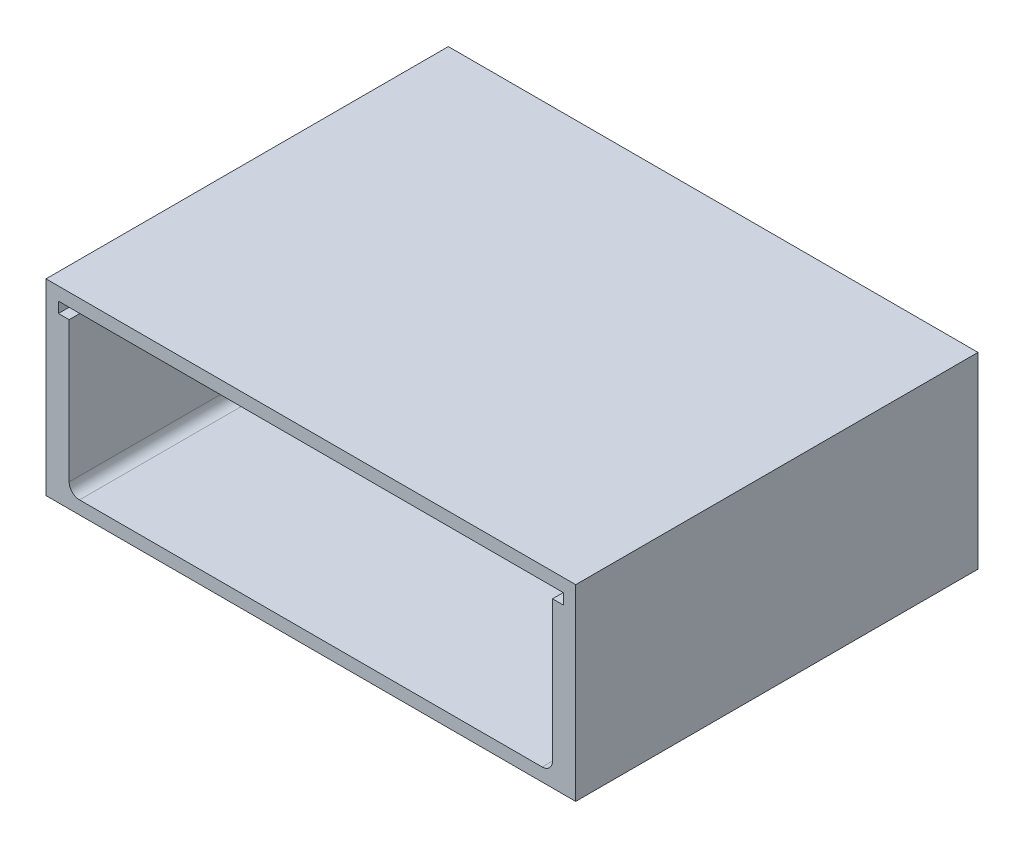
ISO-10303-21;
HEADER;
FILE_DESCRIPTION(('STEP AP214'),'2;1');
FILE_NAME('part.step','',(''),(''),'','','');
FILE_SCHEMA(('AUTOMOTIVE_DESIGN { 1 0 10303 214 1 1 1 1 }'));
ENDSEC;
DATA;
#1=APPLICATION_CONTEXT('core data for automotive mechanical design processes');
#2=APPLICATION_PROTOCOL_DEFINITION('international standard','automotive_design',2000,#1);
#3=PRODUCT_CONTEXT('',#1,'mechanical');
#4=PRODUCT('Part','Part','',(#3));
#5=PRODUCT_RELATED_PRODUCT_CATEGORY('part','',(#4));
#6=PRODUCT_DEFINITION_FORMATION('','',#4);
#7=PRODUCT_DEFINITION_CONTEXT('part definition',#1,'design');
#8=PRODUCT_DEFINITION('design','',#6,#7);
#9=PRODUCT_DEFINITION_SHAPE('','',#8);
#10=(LENGTH_UNIT() NAMED_UNIT(*) SI_UNIT(.MILLI.,.METRE.));
#11=(NAMED_UNIT(*) PLANE_ANGLE_UNIT() SI_UNIT($,.RADIAN.));
#12=(NAMED_UNIT(*) SI_UNIT($,.STERADIAN.) SOLID_ANGLE_UNIT());
#13=UNCERTAINTY_MEASURE_WITH_UNIT(LENGTH_MEASURE(1.E-05),#10,'distance_accuracy_value','');
#14=(GEOMETRIC_REPRESENTATION_CONTEXT(3) GLOBAL_UNCERTAINTY_ASSIGNED_CONTEXT((#13)) GLOBAL_UNIT_ASSIGNED_CONTEXT((#10,
#11,#12)) REPRESENTATION_CONTEXT('',''));
#15=CARTESIAN_POINT('',(0.,0.,0.));
#16=DIRECTION('',(0.,0.,1.));
#17=DIRECTION('',(1.,0.,0.));
#18=AXIS2_PLACEMENT_3D('',#15,#16,#17);
#19=CARTESIAN_POINT('',(0.,0.,60.));
#20=DIRECTION('',(1.,0.,0.));
#21=DIRECTION('',(0.,0.,-1.));
#22=AXIS2_PLACEMENT_3D('',#19,#20,#21);
#23=PLANE('',#22);
#24=DIRECTION('',(0.,-1.,0.));
#25=VECTOR('',#24,1.);
#26=CARTESIAN_POINT('',(0.,0.,0.));
#27=LINE('',#26,#25);
#28=CARTESIAN_POINT('',(0.,28.,0.));
#29=VERTEX_POINT('',#28);
#30=CARTESIAN_POINT('',(0.,0.,0.));
#31=VERTEX_POINT('',#30);
#32=EDGE_CURVE('E322',#29,#31,#27,.T.);
#33=ORIENTED_EDGE('',*,*,#32,.T.);
#34=DIRECTION('',(0.,0.,-1.));
#35=VECTOR('',#34,1.);
#36=CARTESIAN_POINT('',(0.,0.,60.));
#37=LINE('',#36,#35);
#38=CARTESIAN_POINT('',(0.,0.,60.));
#39=VERTEX_POINT('',#38);
#40=EDGE_CURVE('E359',#39,#31,#37,.T.);
#41=ORIENTED_EDGE('',*,*,#40,.F.);
#42=DIRECTION('',(0.,-1.,0.));
#43=VECTOR('',#42,1.);
#44=CARTESIAN_POINT('',(0.,0.,60.));
#45=LINE('',#44,#43);
#46=CARTESIAN_POINT('',(0.,28.,60.));
#47=VERTEX_POINT('',#46);
#48=EDGE_CURVE('E333',#47,#39,#45,.T.);
#49=ORIENTED_EDGE('',*,*,#48,.F.);
#50=DIRECTION('',(0.,0.,-1.));
#51=VECTOR('',#50,1.);
#52=CARTESIAN_POINT('',(0.,28.,60.));
#53=LINE('',#52,#51);
#54=EDGE_CURVE('E343',#47,#29,#53,.T.);
#55=ORIENTED_EDGE('',*,*,#54,.T.);
#56=EDGE_LOOP('',(#33,#41,#49,#55));
#57=FACE_BOUND('',#56,.T.);
#58=ADVANCED_FACE('F33',(#57),#23,.F.);
#59=CARTESIAN_POINT('',(0.,0.,60.));
#60=DIRECTION('',(0.,1.,0.));
#61=DIRECTION('',(0.,0.,1.));
#62=AXIS2_PLACEMENT_3D('',#59,#60,#61);
#63=PLANE('',#62);
#64=DIRECTION('',(1.,0.,0.));
#65=VECTOR('',#64,1.);
#66=CARTESIAN_POINT('',(0.,0.,0.));
#67=LINE('',#66,#65);
#68=CARTESIAN_POINT('',(79.,0.,0.));
#69=VERTEX_POINT('',#68);
#70=EDGE_CURVE('E346',#31,#69,#67,.T.);
#71=ORIENTED_EDGE('',*,*,#70,.T.);
#72=DIRECTION('',(0.,0.,-1.));
#73=VECTOR('',#72,1.);
#74=CARTESIAN_POINT('',(79.,0.,60.));
#75=LINE('',#74,#73);
#76=CARTESIAN_POINT('',(79.,0.,60.));
#77=VERTEX_POINT('',#76);
#78=EDGE_CURVE('E356',#77,#69,#75,.T.);
#79=ORIENTED_EDGE('',*,*,#78,.F.);
#80=DIRECTION('',(1.,0.,0.));
#81=VECTOR('',#80,1.);
#82=CARTESIAN_POINT('',(0.,0.,60.));
#83=LINE('',#82,#81);
#84=EDGE_CURVE('E336',#39,#77,#83,.T.);
#85=ORIENTED_EDGE('',*,*,#84,.F.);
#86=ORIENTED_EDGE('',*,*,#40,.T.);
#87=EDGE_LOOP('',(#71,#79,#85,#86));
#88=FACE_BOUND('',#87,.T.);
#89=ADVANCED_FACE('F524',(#88),#63,.F.);
#90=CARTESIAN_POINT('',(79.,0.,60.));
#91=DIRECTION('',(-1.,0.,0.));
#92=DIRECTION('',(0.,0.,1.));
#93=AXIS2_PLACEMENT_3D('',#90,#91,#92);
#94=PLANE('',#93);
#95=DIRECTION('',(0.,1.,0.));
#96=VECTOR('',#95,1.);
#97=CARTESIAN_POINT('',(79.,0.,0.));
#98=LINE('',#97,#96);
#99=CARTESIAN_POINT('',(79.,28.,0.));
#100=VERTEX_POINT('',#99);
#101=EDGE_CURVE('E348',#69,#100,#98,.T.);
#102=ORIENTED_EDGE('',*,*,#101,.T.);
#103=DIRECTION('',(0.,0.,-1.));
#104=VECTOR('',#103,1.);
#105=CARTESIAN_POINT('',(79.,28.,60.));
#106=LINE('',#105,#104);
#107=CARTESIAN_POINT('',(79.,28.,60.));
#108=VERTEX_POINT('',#107);
#109=EDGE_CURVE('E353',#108,#100,#106,.T.);
#110=ORIENTED_EDGE('',*,*,#109,.F.);
#111=DIRECTION('',(0.,1.,0.));
#112=VECTOR('',#111,1.);
#113=CARTESIAN_POINT('',(79.,0.,60.));
#114=LINE('',#113,#112);
#115=EDGE_CURVE('E339',#77,#108,#114,.T.);
#116=ORIENTED_EDGE('',*,*,#115,.F.);
#117=ORIENTED_EDGE('',*,*,#78,.T.);
#118=EDGE_LOOP('',(#102,#110,#116,#117));
#119=FACE_BOUND('',#118,.T.);
#120=ADVANCED_FACE('F530',(#119),#94,.F.);
#121=CARTESIAN_POINT('',(0.,28.,60.));
#122=DIRECTION('',(0.,-1.,0.));
#123=DIRECTION('',(0.,0.,-1.));
#124=AXIS2_PLACEMENT_3D('',#121,#122,#123);
#125=PLANE('',#124);
#126=DIRECTION('',(-1.,0.,0.));
#127=VECTOR('',#126,1.);
#128=CARTESIAN_POINT('',(0.,28.,0.));
#129=LINE('',#128,#127);
#130=EDGE_CURVE('E337',#100,#29,#129,.T.);
#131=ORIENTED_EDGE('',*,*,#130,.T.);
#132=ORIENTED_EDGE('',*,*,#54,.F.);
#133=DIRECTION('',(-1.,0.,0.));
#134=VECTOR('',#133,1.);
#135=CARTESIAN_POINT('',(0.,28.,60.));
#136=LINE('',#135,#134);
#137=EDGE_CURVE('E341',#108,#47,#136,.T.);
#138=ORIENTED_EDGE('',*,*,#137,.F.);
#139=ORIENTED_EDGE('',*,*,#109,.T.);
#140=EDGE_LOOP('',(#131,#132,#138,#139));
#141=FACE_BOUND('',#140,.T.);
#142=ADVANCED_FACE('F584',(#141),#125,.F.);
#143=CARTESIAN_POINT('',(0.,0.,60.));
#144=DIRECTION('',(0.,0.,-1.));
#145=DIRECTION('',(-1.,0.,0.));
#146=AXIS2_PLACEMENT_3D('',#143,#144,#145);
#147=PLANE('',#146);
#148=DIRECTION('',(0.,-1.,0.));
#149=VECTOR('',#148,1.);
#150=CARTESIAN_POINT('',(1.85,26.05,60.));
#151=LINE('',#150,#149);
#152=CARTESIAN_POINT('',(1.85,26.05,60.));
#153=VERTEX_POINT('',#152);
#154=CARTESIAN_POINT('',(1.85,24.45,60.));
#155=VERTEX_POINT('',#154);
#156=EDGE_CURVE('E273',#153,#155,#151,.T.);
#157=ORIENTED_EDGE('',*,*,#156,.F.);
#158=DIRECTION('',(-1.,0.,0.));
#159=VECTOR('',#158,1.);
#160=CARTESIAN_POINT('',(3.45,26.05,60.));
#161=LINE('',#160,#159);
#162=CARTESIAN_POINT('',(77.15,26.05,60.));
#163=VERTEX_POINT('',#162);
#164=EDGE_CURVE('E278',#163,#153,#161,.T.);
#165=ORIENTED_EDGE('',*,*,#164,.F.);
#166=DIRECTION('',(0.,1.,0.));
#167=VECTOR('',#166,1.);
#168=CARTESIAN_POINT('',(77.15,26.05,60.));
#169=LINE('',#168,#167);
#170=CARTESIAN_POINT('',(77.15,24.45,60.));
#171=VERTEX_POINT('',#170);
#172=EDGE_CURVE('E315',#171,#163,#169,.T.);
#173=ORIENTED_EDGE('',*,*,#172,.F.);
#174=DIRECTION('',(1.,0.,0.));
#175=VECTOR('',#174,1.);
#176=CARTESIAN_POINT('',(75.55,24.45,60.));
#177=LINE('',#176,#175);
#178=CARTESIAN_POINT('',(75.55,24.45,60.));
#179=VERTEX_POINT('',#178);
#180=EDGE_CURVE('E312',#179,#171,#177,.T.);
#181=ORIENTED_EDGE('',*,*,#180,.F.);
#182=DIRECTION('',(0.,1.,0.));
#183=VECTOR('',#182,1.);
#184=CARTESIAN_POINT('',(75.55,24.45,60.));
#185=LINE('',#184,#183);
#186=CARTESIAN_POINT('',(75.55,3.50000000000001,60.));
#187=VERTEX_POINT('',#186);
#188=EDGE_CURVE('E310',#187,#179,#185,.T.);
#189=ORIENTED_EDGE('',*,*,#188,.F.);
#190=CARTESIAN_POINT('',(74.,3.5,60.));
#191=DIRECTION('',(0.,0.,-1.));
#192=DIRECTION('',(-1.,0.,0.));
#193=AXIS2_PLACEMENT_3D('',#190,#191,#192);
#194=CIRCLE('',#193,1.55);
#195=CARTESIAN_POINT('',(74.,1.95,60.));
#196=VERTEX_POINT('',#195);
#197=EDGE_CURVE('E376',#187,#196,#194,.T.);
#198=ORIENTED_EDGE('',*,*,#197,.T.);
#199=DIRECTION('',(1.,0.,0.));
#200=VECTOR('',#199,1.);
#201=CARTESIAN_POINT('',(3.45,1.95,60.));
#202=LINE('',#201,#200);
#203=CARTESIAN_POINT('',(5.,1.95,60.));
#204=VERTEX_POINT('',#203);
#205=EDGE_CURVE('E307',#204,#196,#202,.T.);
#206=ORIENTED_EDGE('',*,*,#205,.F.);
#207=CARTESIAN_POINT('',(5.,3.5,60.));
#208=DIRECTION('',(0.,0.,-1.));
#209=DIRECTION('',(-1.,0.,0.));
#210=AXIS2_PLACEMENT_3D('',#207,#208,#209);
#211=CIRCLE('',#210,1.55);
#212=CARTESIAN_POINT('',(3.45,3.50000000000001,60.));
#213=VERTEX_POINT('',#212);
#214=EDGE_CURVE('E378',#204,#213,#211,.T.);
#215=ORIENTED_EDGE('',*,*,#214,.T.);
#216=DIRECTION('',(0.,-1.,0.));
#217=VECTOR('',#216,1.);
#218=CARTESIAN_POINT('',(3.45,24.45,60.));
#219=LINE('',#218,#217);
#220=CARTESIAN_POINT('',(3.45,24.45,60.));
#221=VERTEX_POINT('',#220);
#222=EDGE_CURVE('E304',#221,#213,#219,.T.);
#223=ORIENTED_EDGE('',*,*,#222,.F.);
#224=DIRECTION('',(1.,0.,0.));
#225=VECTOR('',#224,1.);
#226=CARTESIAN_POINT('',(3.45,24.45,60.));
#227=LINE('',#226,#225);
#228=EDGE_CURVE('E301',#155,#221,#227,.T.);
#229=ORIENTED_EDGE('',*,*,#228,.F.);
#230=EDGE_LOOP('',(#157,#165,#173,#181,#189,#198,#206,#215,#223,#229));
#231=FACE_BOUND('',#230,.T.);
#232=ORIENTED_EDGE('',*,*,#48,.T.);
#233=ORIENTED_EDGE('',*,*,#84,.T.);
#234=ORIENTED_EDGE('',*,*,#115,.T.);
#235=ORIENTED_EDGE('',*,*,#137,.T.);
#236=EDGE_LOOP('',(#232,#233,#234,#235));
#237=FACE_BOUND('',#236,.T.);
#238=ADVANCED_FACE('F581',(#231,#237),#147,.F.);
#239=CARTESIAN_POINT('',(0.,0.,0.));
#240=DIRECTION('',(0.,0.,-1.));
#241=DIRECTION('',(-1.,0.,0.));
#242=AXIS2_PLACEMENT_3D('',#239,#240,#241);
#243=PLANE('',#242);
#244=DIRECTION('',(0.,-1.,0.));
#245=VECTOR('',#244,1.);
#246=CARTESIAN_POINT('',(46.26,0.,0.));
#247=LINE('',#246,#245);
#248=CARTESIAN_POINT('',(46.26,6.5,0.));
#249=VERTEX_POINT('',#248);
#250=CARTESIAN_POINT('',(46.26,5.95,0.));
#251=VERTEX_POINT('',#250);
#252=EDGE_CURVE('E465',#249,#251,#247,.T.);
#253=ORIENTED_EDGE('',*,*,#252,.F.);
#254=CARTESIAN_POINT('',(48.26,6.5,0.));
#255=DIRECTION('',(0.,0.,-1.));
#256=DIRECTION('',(-1.,0.,0.));
#257=AXIS2_PLACEMENT_3D('',#254,#255,#256);
#258=CIRCLE('',#257,2.);
#259=CARTESIAN_POINT('',(48.26,8.5,0.));
#260=VERTEX_POINT('',#259);
#261=EDGE_CURVE('E402',#249,#260,#258,.T.);
#262=ORIENTED_EDGE('',*,*,#261,.T.);
#263=DIRECTION('',(-1.,0.,0.));
#264=VECTOR('',#263,1.);
#265=CARTESIAN_POINT('',(0.,8.49999999999999,0.));
#266=LINE('',#265,#264);
#267=CARTESIAN_POINT('',(70.55,8.5,0.));
#268=VERTEX_POINT('',#267);
#269=EDGE_CURVE('E462',#268,#260,#266,.T.);
#270=ORIENTED_EDGE('',*,*,#269,.F.);
#271=CARTESIAN_POINT('',(70.55,10.5,0.));
#272=DIRECTION('',(0.,0.,-1.));
#273=DIRECTION('',(-1.,0.,0.));
#274=AXIS2_PLACEMENT_3D('',#271,#272,#273);
#275=CIRCLE('',#274,2.);
#276=CARTESIAN_POINT('',(72.55,10.5,0.));
#277=VERTEX_POINT('',#276);
#278=EDGE_CURVE('E419',#268,#277,#275,.F.);
#279=ORIENTED_EDGE('',*,*,#278,.T.);
#280=DIRECTION('',(0.,-1.,0.));
#281=VECTOR('',#280,1.);
#282=CARTESIAN_POINT('',(72.55,0.,0.));
#283=LINE('',#282,#281);
#284=CARTESIAN_POINT('',(72.55,22.05,0.));
#285=VERTEX_POINT('',#284);
#286=EDGE_CURVE('E457',#285,#277,#283,.T.);
#287=ORIENTED_EDGE('',*,*,#286,.F.);
#288=CARTESIAN_POINT('',(70.55,22.05,0.));
#289=DIRECTION('',(0.,0.,-1.));
#290=DIRECTION('',(-1.,0.,0.));
#291=AXIS2_PLACEMENT_3D('',#288,#289,#290);
#292=CIRCLE('',#291,2.);
#293=CARTESIAN_POINT('',(70.55,24.05,0.));
#294=VERTEX_POINT('',#293);
#295=EDGE_CURVE('E415',#285,#294,#292,.F.);
#296=ORIENTED_EDGE('',*,*,#295,.T.);
#297=DIRECTION('',(1.,0.,0.));
#298=VECTOR('',#297,1.);
#299=CARTESIAN_POINT('',(0.,24.05,0.));
#300=LINE('',#299,#298);
#301=CARTESIAN_POINT('',(8.45,24.05,0.));
#302=VERTEX_POINT('',#301);
#303=EDGE_CURVE('E452',#302,#294,#300,.T.);
#304=ORIENTED_EDGE('',*,*,#303,.F.);
#305=CARTESIAN_POINT('',(8.45,22.05,0.));
#306=DIRECTION('',(0.,0.,-1.));
#307=DIRECTION('',(-1.,0.,0.));
#308=AXIS2_PLACEMENT_3D('',#305,#306,#307);
#309=CIRCLE('',#308,2.);
#310=CARTESIAN_POINT('',(6.45,22.05,0.));
#311=VERTEX_POINT('',#310);
#312=EDGE_CURVE('E11',#302,#311,#309,.F.);
#313=ORIENTED_EDGE('',*,*,#312,.T.);
#314=DIRECTION('',(0.,1.,0.));
#315=VECTOR('',#314,1.);
#316=CARTESIAN_POINT('',(6.45,0.,0.));
#317=LINE('',#316,#315);
#318=CARTESIAN_POINT('',(6.45,5.94999999999999,0.));
#319=VERTEX_POINT('',#318);
#320=EDGE_CURVE('E451',#319,#311,#317,.T.);
#321=ORIENTED_EDGE('',*,*,#320,.F.);
#322=CARTESIAN_POINT('',(8.45,5.94999999999999,0.));
#323=DIRECTION('',(0.,0.,-1.));
#324=DIRECTION('',(-1.,0.,0.));
#325=AXIS2_PLACEMENT_3D('',#322,#323,#324);
#326=CIRCLE('',#325,2.);
#327=CARTESIAN_POINT('',(8.45,3.95,0.));
#328=VERTEX_POINT('',#327);
#329=EDGE_CURVE('E48',#319,#328,#326,.F.);
#330=ORIENTED_EDGE('',*,*,#329,.T.);
#331=DIRECTION('',(-1.,0.,0.));
#332=VECTOR('',#331,1.);
#333=CARTESIAN_POINT('',(0.,3.94999999999999,0.));
#334=LINE('',#333,#332);
#335=CARTESIAN_POINT('',(44.26,3.95,0.));
#336=VERTEX_POINT('',#335);
#337=EDGE_CURVE('E443',#336,#328,#334,.T.);
#338=ORIENTED_EDGE('',*,*,#337,.F.);
#339=CARTESIAN_POINT('',(44.26,5.95,0.));
#340=DIRECTION('',(0.,0.,-1.));
#341=DIRECTION('',(-1.,0.,0.));
#342=AXIS2_PLACEMENT_3D('',#339,#340,#341);
#343=CIRCLE('',#342,2.);
#344=EDGE_CURVE('E423',#336,#251,#343,.F.);
#345=ORIENTED_EDGE('',*,*,#344,.T.);
#346=EDGE_LOOP('',(#253,#262,#270,#279,#287,#296,#304,#313,#321,#330,#338,#345));
#347=FACE_BOUND('',#346,.T.);
#348=DIRECTION('',(0.,-1.,0.));
#349=VECTOR('',#348,1.);
#350=CARTESIAN_POINT('',(74.,0.,0.));
#351=LINE('',#350,#349);
#352=CARTESIAN_POINT('',(74.,6.5,0.));
#353=VERTEX_POINT('',#352);
#354=CARTESIAN_POINT('',(74.,3.5,0.));
#355=VERTEX_POINT('',#354);
#356=EDGE_CURVE('E271',#353,#355,#351,.T.);
#357=ORIENTED_EDGE('',*,*,#356,.F.);
#358=DIRECTION('',(1.,0.,0.));
#359=VECTOR('',#358,1.);
#360=CARTESIAN_POINT('',(0.,6.49999999999999,0.));
#361=LINE('',#360,#359);
#362=CARTESIAN_POINT('',(48.26,6.5,0.));
#363=VERTEX_POINT('',#362);
#364=EDGE_CURVE('E264',#363,#353,#361,.T.);
#365=ORIENTED_EDGE('',*,*,#364,.F.);
#366=DIRECTION('',(0.,1.,0.));
#367=VECTOR('',#366,1.);
#368=CARTESIAN_POINT('',(48.26,0.,0.));
#369=LINE('',#368,#367);
#370=CARTESIAN_POINT('',(48.26,3.5,0.));
#371=VERTEX_POINT('',#370);
#372=EDGE_CURVE('E239',#371,#363,#369,.T.);
#373=ORIENTED_EDGE('',*,*,#372,.F.);
#374=DIRECTION('',(-1.,0.,0.));
#375=VECTOR('',#374,1.);
#376=CARTESIAN_POINT('',(0.,3.49999999999999,0.));
#377=LINE('',#376,#375);
#378=EDGE_CURVE('E269',#355,#371,#377,.T.);
#379=ORIENTED_EDGE('',*,*,#378,.F.);
#380=EDGE_LOOP('',(#357,#365,#373,#379));
#381=FACE_BOUND('',#380,.T.);
#382=ORIENTED_EDGE('',*,*,#32,.F.);
#383=ORIENTED_EDGE('',*,*,#130,.F.);
#384=ORIENTED_EDGE('',*,*,#101,.F.);
#385=ORIENTED_EDGE('',*,*,#70,.F.);
#386=EDGE_LOOP('',(#382,#383,#384,#385));
#387=FACE_BOUND('',#386,.T.);
#388=ADVANCED_FACE('F449',(#347,#381,#387),#243,.T.);
#389=CARTESIAN_POINT('',(3.45,26.05,14.));
#390=DIRECTION('',(0.,1.,0.));
#391=DIRECTION('',(0.,0.,1.));
#392=AXIS2_PLACEMENT_3D('',#389,#390,#391);
#393=PLANE('',#392);
#394=ORIENTED_EDGE('',*,*,#164,.T.);
#395=DIRECTION('',(0.,0.,1.));
#396=VECTOR('',#395,1.);
#397=CARTESIAN_POINT('',(1.85,26.05,14.));
#398=LINE('',#397,#396);
#399=CARTESIAN_POINT('',(1.85,26.05,14.));
#400=VERTEX_POINT('',#399);
#401=EDGE_CURVE('E298',#400,#153,#398,.T.);
#402=ORIENTED_EDGE('',*,*,#401,.F.);
#403=DIRECTION('',(-1.,0.,0.));
#404=VECTOR('',#403,1.);
#405=CARTESIAN_POINT('',(3.45,26.05,14.));
#406=LINE('',#405,#404);
#407=CARTESIAN_POINT('',(77.15,26.05,14.));
#408=VERTEX_POINT('',#407);
#409=EDGE_CURVE('E274',#408,#400,#406,.T.);
#410=ORIENTED_EDGE('',*,*,#409,.F.);
#411=DIRECTION('',(0.,0.,1.));
#412=VECTOR('',#411,1.);
#413=CARTESIAN_POINT('',(77.15,26.05,14.));
#414=LINE('',#413,#412);
#415=EDGE_CURVE('E320',#408,#163,#414,.T.);
#416=ORIENTED_EDGE('',*,*,#415,.T.);
#417=EDGE_LOOP('',(#394,#402,#410,#416));
#418=FACE_BOUND('',#417,.T.);
#419=ADVANCED_FACE('F561',(#418),#393,.F.);
#420=CARTESIAN_POINT('',(77.15,26.05,14.));
#421=DIRECTION('',(1.,0.,0.));
#422=DIRECTION('',(0.,0.,-1.));
#423=AXIS2_PLACEMENT_3D('',#420,#421,#422);
#424=PLANE('',#423);
#425=ORIENTED_EDGE('',*,*,#172,.T.);
#426=ORIENTED_EDGE('',*,*,#415,.F.);
#427=DIRECTION('',(0.,1.,0.));
#428=VECTOR('',#427,1.);
#429=CARTESIAN_POINT('',(77.15,26.05,14.));
#430=LINE('',#429,#428);
#431=CARTESIAN_POINT('',(77.15,24.45,14.));
#432=VERTEX_POINT('',#431);
#433=EDGE_CURVE('E295',#432,#408,#430,.T.);
#434=ORIENTED_EDGE('',*,*,#433,.F.);
#435=DIRECTION('',(0.,0.,1.));
#436=VECTOR('',#435,1.);
#437=CARTESIAN_POINT('',(77.15,24.45,14.));
#438=LINE('',#437,#436);
#439=EDGE_CURVE('E323',#432,#171,#438,.T.);
#440=ORIENTED_EDGE('',*,*,#439,.T.);
#441=EDGE_LOOP('',(#425,#426,#434,#440));
#442=FACE_BOUND('',#441,.T.);
#443=ADVANCED_FACE('F557',(#442),#424,.F.);
#444=CARTESIAN_POINT('',(75.55,24.45,14.));
#445=DIRECTION('',(0.,-1.,0.));
#446=DIRECTION('',(0.,0.,-1.));
#447=AXIS2_PLACEMENT_3D('',#444,#445,#446);
#448=PLANE('',#447);
#449=ORIENTED_EDGE('',*,*,#180,.T.);
#450=ORIENTED_EDGE('',*,*,#439,.F.);
#451=DIRECTION('',(1.,0.,0.));
#452=VECTOR('',#451,1.);
#453=CARTESIAN_POINT('',(75.55,24.45,14.));
#454=LINE('',#453,#452);
#455=CARTESIAN_POINT('',(75.55,24.45,14.));
#456=VERTEX_POINT('',#455);
#457=EDGE_CURVE('E292',#456,#432,#454,.T.);
#458=ORIENTED_EDGE('',*,*,#457,.F.);
#459=DIRECTION('',(0.,0.,1.));
#460=VECTOR('',#459,1.);
#461=CARTESIAN_POINT('',(75.55,24.45,14.));
#462=LINE('',#461,#460);
#463=EDGE_CURVE('E325',#456,#179,#462,.T.);
#464=ORIENTED_EDGE('',*,*,#463,.T.);
#465=EDGE_LOOP('',(#449,#450,#458,#464));
#466=FACE_BOUND('',#465,.T.);
#467=ADVANCED_FACE('F553',(#466),#448,.F.);
#468=CARTESIAN_POINT('',(75.55,24.45,14.));
#469=DIRECTION('',(1.,0.,0.));
#470=DIRECTION('',(0.,0.,-1.));
#471=AXIS2_PLACEMENT_3D('',#468,#469,#470);
#472=PLANE('',#471);
#473=DIRECTION('',(0.,1.,0.));
#474=VECTOR('',#473,1.);
#475=CARTESIAN_POINT('',(75.55,24.45,14.));
#476=LINE('',#475,#474);
#477=CARTESIAN_POINT('',(75.55,3.50000000000001,14.));
#478=VERTEX_POINT('',#477);
#479=EDGE_CURVE('E290',#478,#456,#476,.T.);
#480=ORIENTED_EDGE('',*,*,#479,.F.);
#481=DIRECTION('',(0.,0.,1.));
#482=VECTOR('',#481,1.);
#483=CARTESIAN_POINT('',(75.55,3.5,60.));
#484=LINE('',#483,#482);
#485=EDGE_CURVE('E362',#478,#187,#484,.T.);
#486=ORIENTED_EDGE('',*,*,#485,.T.);
#487=ORIENTED_EDGE('',*,*,#188,.T.);
#488=ORIENTED_EDGE('',*,*,#463,.F.);
#489=EDGE_LOOP('',(#480,#486,#487,#488));
#490=FACE_BOUND('',#489,.T.);
#491=ADVANCED_FACE('F548',(#490),#472,.F.);
#492=CARTESIAN_POINT('',(3.45,1.95,14.));
#493=DIRECTION('',(0.,-1.,0.));
#494=DIRECTION('',(0.,0.,-1.));
#495=AXIS2_PLACEMENT_3D('',#492,#493,#494);
#496=PLANE('',#495);
#497=ORIENTED_EDGE('',*,*,#205,.T.);
#498=DIRECTION('',(0.,0.,1.));
#499=VECTOR('',#498,1.);
#500=CARTESIAN_POINT('',(74.,1.95,14.));
#501=LINE('',#500,#499);
#502=CARTESIAN_POINT('',(74.,1.95,14.));
#503=VERTEX_POINT('',#502);
#504=EDGE_CURVE('E368',#196,#503,#501,.F.);
#505=ORIENTED_EDGE('',*,*,#504,.T.);
#506=DIRECTION('',(1.,0.,0.));
#507=VECTOR('',#506,1.);
#508=CARTESIAN_POINT('',(3.45,1.95,14.));
#509=LINE('',#508,#507);
#510=CARTESIAN_POINT('',(5.,1.95,14.));
#511=VERTEX_POINT('',#510);
#512=EDGE_CURVE('E287',#511,#503,#509,.T.);
#513=ORIENTED_EDGE('',*,*,#512,.F.);
#514=DIRECTION('',(0.,0.,1.));
#515=VECTOR('',#514,1.);
#516=CARTESIAN_POINT('',(5.,1.95,60.));
#517=LINE('',#516,#515);
#518=EDGE_CURVE('E365',#511,#204,#517,.T.);
#519=ORIENTED_EDGE('',*,*,#518,.T.);
#520=EDGE_LOOP('',(#497,#505,#513,#519));
#521=FACE_BOUND('',#520,.T.);
#522=ADVANCED_FACE('F578',(#521),#496,.F.);
#523=CARTESIAN_POINT('',(3.45,24.45,14.));
#524=DIRECTION('',(-1.,0.,0.));
#525=DIRECTION('',(0.,-1.,0.));
#526=AXIS2_PLACEMENT_3D('',#523,#524,#525);
#527=PLANE('',#526);
#528=ORIENTED_EDGE('',*,*,#222,.T.);
#529=DIRECTION('',(0.,0.,1.));
#530=VECTOR('',#529,1.);
#531=CARTESIAN_POINT('',(3.45,3.5,14.));
#532=LINE('',#531,#530);
#533=CARTESIAN_POINT('',(3.45,3.50000000000001,14.));
#534=VERTEX_POINT('',#533);
#535=EDGE_CURVE('E374',#213,#534,#532,.F.);
#536=ORIENTED_EDGE('',*,*,#535,.T.);
#537=DIRECTION('',(0.,-1.,0.));
#538=VECTOR('',#537,1.);
#539=CARTESIAN_POINT('',(3.45,24.45,14.));
#540=LINE('',#539,#538);
#541=CARTESIAN_POINT('',(3.45,24.45,14.));
#542=VERTEX_POINT('',#541);
#543=EDGE_CURVE('E284',#542,#534,#540,.T.);
#544=ORIENTED_EDGE('',*,*,#543,.F.);
#545=DIRECTION('',(0.,0.,1.));
#546=VECTOR('',#545,1.);
#547=CARTESIAN_POINT('',(3.45,24.45,14.));
#548=LINE('',#547,#546);
#549=EDGE_CURVE('E328',#542,#221,#548,.T.);
#550=ORIENTED_EDGE('',*,*,#549,.T.);
#551=EDGE_LOOP('',(#528,#536,#544,#550));
#552=FACE_BOUND('',#551,.T.);
#553=ADVANCED_FACE('F574',(#552),#527,.F.);
#554=CARTESIAN_POINT('',(3.45,24.45,14.));
#555=DIRECTION('',(0.,-1.,0.));
#556=DIRECTION('',(0.,0.,-1.));
#557=AXIS2_PLACEMENT_3D('',#554,#555,#556);
#558=PLANE('',#557);
#559=ORIENTED_EDGE('',*,*,#228,.T.);
#560=ORIENTED_EDGE('',*,*,#549,.F.);
#561=DIRECTION('',(1.,0.,0.));
#562=VECTOR('',#561,1.);
#563=CARTESIAN_POINT('',(3.45,24.45,14.));
#564=LINE('',#563,#562);
#565=CARTESIAN_POINT('',(1.85,24.45,14.));
#566=VERTEX_POINT('',#565);
#567=EDGE_CURVE('E281',#566,#542,#564,.T.);
#568=ORIENTED_EDGE('',*,*,#567,.F.);
#569=DIRECTION('',(0.,0.,1.));
#570=VECTOR('',#569,1.);
#571=CARTESIAN_POINT('',(1.85,24.45,14.));
#572=LINE('',#571,#570);
#573=EDGE_CURVE('E330',#566,#155,#572,.T.);
#574=ORIENTED_EDGE('',*,*,#573,.T.);
#575=EDGE_LOOP('',(#559,#560,#568,#574));
#576=FACE_BOUND('',#575,.T.);
#577=ADVANCED_FACE('F570',(#576),#558,.F.);
#578=CARTESIAN_POINT('',(1.85,26.05,14.));
#579=DIRECTION('',(-1.,0.,0.));
#580=DIRECTION('',(0.,-1.,0.));
#581=AXIS2_PLACEMENT_3D('',#578,#579,#580);
#582=PLANE('',#581);
#583=ORIENTED_EDGE('',*,*,#156,.T.);
#584=ORIENTED_EDGE('',*,*,#573,.F.);
#585=DIRECTION('',(0.,-1.,0.));
#586=VECTOR('',#585,1.);
#587=CARTESIAN_POINT('',(1.85,26.05,14.));
#588=LINE('',#587,#586);
#589=EDGE_CURVE('E277',#400,#566,#588,.T.);
#590=ORIENTED_EDGE('',*,*,#589,.F.);
#591=ORIENTED_EDGE('',*,*,#401,.T.);
#592=EDGE_LOOP('',(#583,#584,#590,#591));
#593=FACE_BOUND('',#592,.T.);
#594=ADVANCED_FACE('F565',(#593),#582,.F.);
#595=CARTESIAN_POINT('',(0.,0.,14.));
#596=DIRECTION('',(0.,0.,1.));
#597=DIRECTION('',(1.,0.,0.));
#598=AXIS2_PLACEMENT_3D('',#595,#596,#597);
#599=PLANE('',#598);
#600=DIRECTION('',(1.,0.,0.));
#601=VECTOR('',#600,1.);
#602=CARTESIAN_POINT('',(72.55,8.5,14.));
#603=LINE('',#602,#601);
#604=CARTESIAN_POINT('',(48.26,8.5,14.));
#605=VERTEX_POINT('',#604);
#606=CARTESIAN_POINT('',(70.55,8.5,14.));
#607=VERTEX_POINT('',#606);
#608=EDGE_CURVE('E471',#605,#607,#603,.T.);
#609=ORIENTED_EDGE('',*,*,#608,.F.);
#610=CARTESIAN_POINT('',(48.26,6.5,14.));
#611=DIRECTION('',(0.,0.,1.));
#612=DIRECTION('',(1.,0.,0.));
#613=AXIS2_PLACEMENT_3D('',#610,#611,#612);
#614=CIRCLE('',#613,2.);
#615=CARTESIAN_POINT('',(46.26,6.5,14.));
#616=VERTEX_POINT('',#615);
#617=EDGE_CURVE('E395',#605,#616,#614,.T.);
#618=ORIENTED_EDGE('',*,*,#617,.T.);
#619=DIRECTION('',(0.,1.,0.));
#620=VECTOR('',#619,1.);
#621=CARTESIAN_POINT('',(46.26,8.5,14.));
#622=LINE('',#621,#620);
#623=CARTESIAN_POINT('',(46.26,5.95,14.));
#624=VERTEX_POINT('',#623);
#625=EDGE_CURVE('E474',#624,#616,#622,.T.);
#626=ORIENTED_EDGE('',*,*,#625,.F.);
#627=CARTESIAN_POINT('',(44.26,5.95,14.));
#628=DIRECTION('',(0.,0.,1.));
#629=DIRECTION('',(1.,0.,0.));
#630=AXIS2_PLACEMENT_3D('',#627,#628,#629);
#631=CIRCLE('',#630,2.);
#632=CARTESIAN_POINT('',(44.26,3.95,14.));
#633=VERTEX_POINT('',#632);
#634=EDGE_CURVE('E421',#624,#633,#631,.F.);
#635=ORIENTED_EDGE('',*,*,#634,.T.);
#636=DIRECTION('',(1.,0.,0.));
#637=VECTOR('',#636,1.);
#638=CARTESIAN_POINT('',(46.26,3.95,14.));
#639=LINE('',#638,#637);
#640=CARTESIAN_POINT('',(8.45,3.95,14.));
#641=VERTEX_POINT('',#640);
#642=EDGE_CURVE('E477',#641,#633,#639,.T.);
#643=ORIENTED_EDGE('',*,*,#642,.F.);
#644=CARTESIAN_POINT('',(8.45,5.94999999999999,14.));
#645=DIRECTION('',(0.,0.,1.));
#646=DIRECTION('',(1.,0.,0.));
#647=AXIS2_PLACEMENT_3D('',#644,#645,#646);
#648=CIRCLE('',#647,2.);
#649=CARTESIAN_POINT('',(6.45,5.94999999999999,14.));
#650=VERTEX_POINT('',#649);
#651=EDGE_CURVE('E425',#641,#650,#648,.F.);
#652=ORIENTED_EDGE('',*,*,#651,.T.);
#653=DIRECTION('',(0.,-1.,0.));
#654=VECTOR('',#653,1.);
#655=CARTESIAN_POINT('',(6.45,3.95,14.));
#656=LINE('',#655,#654);
#657=CARTESIAN_POINT('',(6.45,22.05,14.));
#658=VERTEX_POINT('',#657);
#659=EDGE_CURVE('E434',#658,#650,#656,.T.);
#660=ORIENTED_EDGE('',*,*,#659,.F.);
#661=CARTESIAN_POINT('',(8.45,22.05,14.));
#662=DIRECTION('',(0.,0.,1.));
#663=DIRECTION('',(1.,0.,0.));
#664=AXIS2_PLACEMENT_3D('',#661,#662,#663);
#665=CIRCLE('',#664,2.);
#666=CARTESIAN_POINT('',(8.45,24.05,14.));
#667=VERTEX_POINT('',#666);
#668=EDGE_CURVE('E41',#658,#667,#665,.F.);
#669=ORIENTED_EDGE('',*,*,#668,.T.);
#670=DIRECTION('',(-1.,0.,0.));
#671=VECTOR('',#670,1.);
#672=CARTESIAN_POINT('',(6.45,24.05,14.));
#673=LINE('',#672,#671);
#674=CARTESIAN_POINT('',(70.55,24.05,14.));
#675=VERTEX_POINT('',#674);
#676=EDGE_CURVE('E432',#675,#667,#673,.T.);
#677=ORIENTED_EDGE('',*,*,#676,.F.);
#678=CARTESIAN_POINT('',(70.55,22.05,14.));
#679=DIRECTION('',(0.,0.,1.));
#680=DIRECTION('',(1.,0.,0.));
#681=AXIS2_PLACEMENT_3D('',#678,#679,#680);
#682=CIRCLE('',#681,2.);
#683=CARTESIAN_POINT('',(72.55,22.05,14.));
#684=VERTEX_POINT('',#683);
#685=EDGE_CURVE('E413',#675,#684,#682,.F.);
#686=ORIENTED_EDGE('',*,*,#685,.T.);
#687=DIRECTION('',(0.,1.,0.));
#688=VECTOR('',#687,1.);
#689=CARTESIAN_POINT('',(72.55,24.05,14.));
#690=LINE('',#689,#688);
#691=CARTESIAN_POINT('',(72.55,10.5,14.));
#692=VERTEX_POINT('',#691);
#693=EDGE_CURVE('E444',#692,#684,#690,.T.);
#694=ORIENTED_EDGE('',*,*,#693,.F.);
#695=CARTESIAN_POINT('',(70.55,10.5,14.));
#696=DIRECTION('',(0.,0.,1.));
#697=DIRECTION('',(1.,0.,0.));
#698=AXIS2_PLACEMENT_3D('',#695,#696,#697);
#699=CIRCLE('',#698,2.);
#700=EDGE_CURVE('E417',#692,#607,#699,.F.);
#701=ORIENTED_EDGE('',*,*,#700,.T.);
#702=EDGE_LOOP('',(#609,#618,#626,#635,#643,#652,#660,#669,#677,#686,#694,#701));
#703=FACE_BOUND('',#702,.T.);
#704=DIRECTION('',(0.,1.,0.));
#705=VECTOR('',#704,1.);
#706=CARTESIAN_POINT('',(74.,3.5,14.));
#707=LINE('',#706,#705);
#708=CARTESIAN_POINT('',(74.,3.5,14.));
#709=VERTEX_POINT('',#708);
#710=CARTESIAN_POINT('',(74.,6.5,14.));
#711=VERTEX_POINT('',#710);
#712=EDGE_CURVE('E252',#709,#711,#707,.T.);
#713=ORIENTED_EDGE('',*,*,#712,.F.);
#714=DIRECTION('',(1.,0.,0.));
#715=VECTOR('',#714,1.);
#716=CARTESIAN_POINT('',(74.,3.5,14.));
#717=LINE('',#716,#715);
#718=CARTESIAN_POINT('',(48.26,3.5,14.));
#719=VERTEX_POINT('',#718);
#720=EDGE_CURVE('E257',#719,#709,#717,.T.);
#721=ORIENTED_EDGE('',*,*,#720,.F.);
#722=DIRECTION('',(0.,-1.,0.));
#723=VECTOR('',#722,1.);
#724=CARTESIAN_POINT('',(48.26,3.5,14.));
#725=LINE('',#724,#723);
#726=CARTESIAN_POINT('',(48.26,6.5,14.));
#727=VERTEX_POINT('',#726);
#728=EDGE_CURVE('E236',#727,#719,#725,.T.);
#729=ORIENTED_EDGE('',*,*,#728,.F.);
#730=DIRECTION('',(-1.,0.,0.));
#731=VECTOR('',#730,1.);
#732=CARTESIAN_POINT('',(74.,6.5,14.));
#733=LINE('',#732,#731);
#734=EDGE_CURVE('E247',#711,#727,#733,.T.);
#735=ORIENTED_EDGE('',*,*,#734,.F.);
#736=EDGE_LOOP('',(#713,#721,#729,#735));
#737=FACE_BOUND('',#736,.T.);
#738=ORIENTED_EDGE('',*,*,#512,.T.);
#739=CARTESIAN_POINT('',(74.,3.5,14.));
#740=DIRECTION('',(0.,0.,1.));
#741=DIRECTION('',(1.,0.,0.));
#742=AXIS2_PLACEMENT_3D('',#739,#740,#741);
#743=CIRCLE('',#742,1.55);
#744=EDGE_CURVE('E372',#503,#478,#743,.T.);
#745=ORIENTED_EDGE('',*,*,#744,.T.);
#746=ORIENTED_EDGE('',*,*,#479,.T.);
#747=ORIENTED_EDGE('',*,*,#457,.T.);
#748=ORIENTED_EDGE('',*,*,#433,.T.);
#749=ORIENTED_EDGE('',*,*,#409,.T.);
#750=ORIENTED_EDGE('',*,*,#589,.T.);
#751=ORIENTED_EDGE('',*,*,#567,.T.);
#752=ORIENTED_EDGE('',*,*,#543,.T.);
#753=CARTESIAN_POINT('',(5.,3.5,14.));
#754=DIRECTION('',(0.,0.,1.));
#755=DIRECTION('',(1.,0.,0.));
#756=AXIS2_PLACEMENT_3D('',#753,#754,#755);
#757=CIRCLE('',#756,1.55);
#758=EDGE_CURVE('E370',#534,#511,#757,.T.);
#759=ORIENTED_EDGE('',*,*,#758,.T.);
#760=EDGE_LOOP('',(#738,#745,#746,#747,#748,#749,#750,#751,#752,#759));
#761=FACE_BOUND('',#760,.T.);
#762=ADVANCED_FACE('F254',(#703,#737,#761),#599,.T.);
#763=CARTESIAN_POINT('',(74.,3.5,-12.));
#764=DIRECTION('',(1.,0.,0.));
#765=DIRECTION('',(0.,0.,-1.));
#766=AXIS2_PLACEMENT_3D('',#763,#764,#765);
#767=PLANE('',#766);
#768=ORIENTED_EDGE('',*,*,#356,.T.);
#769=DIRECTION('',(0.,0.,1.));
#770=VECTOR('',#769,1.);
#771=CARTESIAN_POINT('',(74.,3.5,-12.));
#772=LINE('',#771,#770);
#773=EDGE_CURVE('E262',#355,#709,#772,.T.);
#774=ORIENTED_EDGE('',*,*,#773,.T.);
#775=ORIENTED_EDGE('',*,*,#712,.T.);
#776=DIRECTION('',(0.,0.,1.));
#777=VECTOR('',#776,1.);
#778=CARTESIAN_POINT('',(74.,6.5,-12.));
#779=LINE('',#778,#777);
#780=EDGE_CURVE('E243',#353,#711,#779,.T.);
#781=ORIENTED_EDGE('',*,*,#780,.F.);
#782=EDGE_LOOP('',(#768,#774,#775,#781));
#783=FACE_BOUND('',#782,.T.);
#784=ADVANCED_FACE('F681',(#783),#767,.F.);
#785=CARTESIAN_POINT('',(74.,3.5,-12.));
#786=DIRECTION('',(0.,-1.,0.));
#787=DIRECTION('',(1.,0.,0.));
#788=AXIS2_PLACEMENT_3D('',#785,#786,#787);
#789=PLANE('',#788);
#790=ORIENTED_EDGE('',*,*,#378,.T.);
#791=DIRECTION('',(0.,0.,1.));
#792=VECTOR('',#791,1.);
#793=CARTESIAN_POINT('',(48.26,3.5,-12.));
#794=LINE('',#793,#792);
#795=EDGE_CURVE('E242',#371,#719,#794,.T.);
#796=ORIENTED_EDGE('',*,*,#795,.T.);
#797=ORIENTED_EDGE('',*,*,#720,.T.);
#798=ORIENTED_EDGE('',*,*,#773,.F.);
#799=EDGE_LOOP('',(#790,#796,#797,#798));
#800=FACE_BOUND('',#799,.T.);
#801=ADVANCED_FACE('F774',(#800),#789,.F.);
#802=CARTESIAN_POINT('',(48.26,3.5,-12.));
#803=DIRECTION('',(-1.,0.,0.));
#804=DIRECTION('',(0.,0.,1.));
#805=AXIS2_PLACEMENT_3D('',#802,#803,#804);
#806=PLANE('',#805);
#807=ORIENTED_EDGE('',*,*,#372,.T.);
#808=DIRECTION('',(0.,0.,1.));
#809=VECTOR('',#808,1.);
#810=CARTESIAN_POINT('',(48.26,6.5,-12.));
#811=LINE('',#810,#809);
#812=EDGE_CURVE('E231',#363,#727,#811,.T.);
#813=ORIENTED_EDGE('',*,*,#812,.T.);
#814=ORIENTED_EDGE('',*,*,#728,.T.);
#815=ORIENTED_EDGE('',*,*,#795,.F.);
#816=EDGE_LOOP('',(#807,#813,#814,#815));
#817=FACE_BOUND('',#816,.T.);
#818=ADVANCED_FACE('F233',(#817),#806,.F.);
#819=CARTESIAN_POINT('',(74.,6.5,-12.));
#820=DIRECTION('',(0.,1.,0.));
#821=DIRECTION('',(-1.,0.,0.));
#822=AXIS2_PLACEMENT_3D('',#819,#820,#821);
#823=PLANE('',#822);
#824=ORIENTED_EDGE('',*,*,#364,.T.);
#825=ORIENTED_EDGE('',*,*,#780,.T.);
#826=ORIENTED_EDGE('',*,*,#734,.T.);
#827=ORIENTED_EDGE('',*,*,#812,.F.);
#828=EDGE_LOOP('',(#824,#825,#826,#827));
#829=FACE_BOUND('',#828,.T.);
#830=ADVANCED_FACE('F248',(#829),#823,.F.);
#831=CARTESIAN_POINT('',(6.45,3.95,-12.));
#832=DIRECTION('',(-1.,0.,0.));
#833=DIRECTION('',(0.,-1.,0.));
#834=AXIS2_PLACEMENT_3D('',#831,#832,#833);
#835=PLANE('',#834);
#836=ORIENTED_EDGE('',*,*,#659,.T.);
#837=DIRECTION('',(0.,0.,1.));
#838=VECTOR('',#837,1.);
#839=CARTESIAN_POINT('',(6.45,5.94999999999999,0.));
#840=LINE('',#839,#838);
#841=EDGE_CURVE('E411',#650,#319,#840,.F.);
#842=ORIENTED_EDGE('',*,*,#841,.T.);
#843=ORIENTED_EDGE('',*,*,#320,.T.);
#844=DIRECTION('',(0.,0.,1.));
#845=VECTOR('',#844,1.);
#846=CARTESIAN_POINT('',(6.45,22.05,14.));
#847=LINE('',#846,#845);
#848=EDGE_CURVE('E408',#311,#658,#847,.T.);
#849=ORIENTED_EDGE('',*,*,#848,.T.);
#850=EDGE_LOOP('',(#836,#842,#843,#849));
#851=FACE_BOUND('',#850,.T.);
#852=ADVANCED_FACE('F454',(#851),#835,.F.);
#853=CARTESIAN_POINT('',(6.45,24.05,-12.));
#854=DIRECTION('',(0.,1.,0.));
#855=DIRECTION('',(0.,0.,1.));
#856=AXIS2_PLACEMENT_3D('',#853,#854,#855);
#857=PLANE('',#856);
#858=ORIENTED_EDGE('',*,*,#303,.T.);
#859=DIRECTION('',(0.,0.,1.));
#860=VECTOR('',#859,1.);
#861=CARTESIAN_POINT('',(70.55,24.05,14.));
#862=LINE('',#861,#860);
#863=EDGE_CURVE('E382',#294,#675,#862,.T.);
#864=ORIENTED_EDGE('',*,*,#863,.T.);
#865=ORIENTED_EDGE('',*,*,#676,.T.);
#866=DIRECTION('',(0.,0.,1.));
#867=VECTOR('',#866,1.);
#868=CARTESIAN_POINT('',(8.45,24.05,0.));
#869=LINE('',#868,#867);
#870=EDGE_CURVE('E380',#667,#302,#869,.F.);
#871=ORIENTED_EDGE('',*,*,#870,.T.);
#872=EDGE_LOOP('',(#858,#864,#865,#871));
#873=FACE_BOUND('',#872,.T.);
#874=ADVANCED_FACE('F440',(#873),#857,.F.);
#875=CARTESIAN_POINT('',(72.55,24.05,-12.));
#876=DIRECTION('',(1.,0.,0.));
#877=DIRECTION('',(0.,0.,-1.));
#878=AXIS2_PLACEMENT_3D('',#875,#876,#877);
#879=PLANE('',#878);
#880=ORIENTED_EDGE('',*,*,#693,.T.);
#881=DIRECTION('',(0.,0.,1.));
#882=VECTOR('',#881,1.);
#883=CARTESIAN_POINT('',(72.55,22.05,0.));
#884=LINE('',#883,#882);
#885=EDGE_CURVE('E388',#684,#285,#884,.F.);
#886=ORIENTED_EDGE('',*,*,#885,.T.);
#887=ORIENTED_EDGE('',*,*,#286,.T.);
#888=DIRECTION('',(0.,0.,1.));
#889=VECTOR('',#888,1.);
#890=CARTESIAN_POINT('',(72.55,10.5,14.));
#891=LINE('',#890,#889);
#892=EDGE_CURVE('E385',#277,#692,#891,.T.);
#893=ORIENTED_EDGE('',*,*,#892,.T.);
#894=EDGE_LOOP('',(#880,#886,#887,#893));
#895=FACE_BOUND('',#894,.T.);
#896=ADVANCED_FACE('F506',(#895),#879,.F.);
#897=CARTESIAN_POINT('',(72.55,8.5,-12.));
#898=DIRECTION('',(0.,-1.,0.));
#899=DIRECTION('',(1.,0.,0.));
#900=AXIS2_PLACEMENT_3D('',#897,#898,#899);
#901=PLANE('',#900);
#902=ORIENTED_EDGE('',*,*,#608,.T.);
#903=DIRECTION('',(0.,0.,1.));
#904=VECTOR('',#903,1.);
#905=CARTESIAN_POINT('',(70.55,8.5,0.));
#906=LINE('',#905,#904);
#907=EDGE_CURVE('E393',#607,#268,#906,.F.);
#908=ORIENTED_EDGE('',*,*,#907,.T.);
#909=ORIENTED_EDGE('',*,*,#269,.T.);
#910=DIRECTION('',(0.,0.,1.));
#911=VECTOR('',#910,1.);
#912=CARTESIAN_POINT('',(48.26,8.5,-12.));
#913=LINE('',#912,#911);
#914=EDGE_CURVE('E390',#260,#605,#913,.T.);
#915=ORIENTED_EDGE('',*,*,#914,.T.);
#916=EDGE_LOOP('',(#902,#908,#909,#915));
#917=FACE_BOUND('',#916,.T.);
#918=ADVANCED_FACE('F498',(#917),#901,.F.);
#919=CARTESIAN_POINT('',(46.26,8.5,-12.));
#920=DIRECTION('',(1.,0.,0.));
#921=DIRECTION('',(0.,0.,-1.));
#922=AXIS2_PLACEMENT_3D('',#919,#920,#921);
#923=PLANE('',#922);
#924=ORIENTED_EDGE('',*,*,#625,.T.);
#925=DIRECTION('',(0.,0.,1.));
#926=VECTOR('',#925,1.);
#927=CARTESIAN_POINT('',(46.26,6.5,-12.));
#928=LINE('',#927,#926);
#929=EDGE_CURVE('E400',#616,#249,#928,.F.);
#930=ORIENTED_EDGE('',*,*,#929,.T.);
#931=ORIENTED_EDGE('',*,*,#252,.T.);
#932=DIRECTION('',(0.,0.,1.));
#933=VECTOR('',#932,1.);
#934=CARTESIAN_POINT('',(46.26,5.95,14.));
#935=LINE('',#934,#933);
#936=EDGE_CURVE('E397',#251,#624,#935,.T.);
#937=ORIENTED_EDGE('',*,*,#936,.T.);
#938=EDGE_LOOP('',(#924,#930,#931,#937));
#939=FACE_BOUND('',#938,.T.);
#940=ADVANCED_FACE('F490',(#939),#923,.F.);
#941=CARTESIAN_POINT('',(46.26,3.95,-12.));
#942=DIRECTION('',(0.,-1.,0.));
#943=DIRECTION('',(1.,0.,0.));
#944=AXIS2_PLACEMENT_3D('',#941,#942,#943);
#945=PLANE('',#944);
#946=ORIENTED_EDGE('',*,*,#642,.T.);
#947=DIRECTION('',(0.,0.,1.));
#948=VECTOR('',#947,1.);
#949=CARTESIAN_POINT('',(44.26,3.95,0.));
#950=LINE('',#949,#948);
#951=EDGE_CURVE('E55',#633,#336,#950,.F.);
#952=ORIENTED_EDGE('',*,*,#951,.T.);
#953=ORIENTED_EDGE('',*,*,#337,.T.);
#954=DIRECTION('',(0.,0.,1.));
#955=VECTOR('',#954,1.);
#956=CARTESIAN_POINT('',(8.45,3.95,14.));
#957=LINE('',#956,#955);
#958=EDGE_CURVE('E404',#328,#641,#957,.T.);
#959=ORIENTED_EDGE('',*,*,#958,.T.);
#960=EDGE_LOOP('',(#946,#952,#953,#959));
#961=FACE_BOUND('',#960,.T.);
#962=ADVANCED_FACE('F483',(#961),#945,.F.);
#963=CARTESIAN_POINT('',(74.,3.5,14.));
#964=DIRECTION('',(0.,0.,-1.));
#965=DIRECTION('',(-1.,0.,0.));
#966=AXIS2_PLACEMENT_3D('',#963,#964,#965);
#967=CYLINDRICAL_SURFACE('',#966,1.55);
#968=ORIENTED_EDGE('',*,*,#744,.F.);
#969=ORIENTED_EDGE('',*,*,#504,.F.);
#970=ORIENTED_EDGE('',*,*,#197,.F.);
#971=ORIENTED_EDGE('',*,*,#485,.F.);
#972=EDGE_LOOP('',(#968,#969,#970,#971));
#973=FACE_BOUND('',#972,.T.);
#974=ADVANCED_FACE('F520',(#973),#967,.F.);
#975=CARTESIAN_POINT('',(5.,3.5,14.));
#976=DIRECTION('',(0.,0.,-1.));
#977=DIRECTION('',(-1.,0.,0.));
#978=AXIS2_PLACEMENT_3D('',#975,#976,#977);
#979=CYLINDRICAL_SURFACE('',#978,1.55);
#980=ORIENTED_EDGE('',*,*,#758,.F.);
#981=ORIENTED_EDGE('',*,*,#535,.F.);
#982=ORIENTED_EDGE('',*,*,#214,.F.);
#983=ORIENTED_EDGE('',*,*,#518,.F.);
#984=EDGE_LOOP('',(#980,#981,#982,#983));
#985=FACE_BOUND('',#984,.T.);
#986=ADVANCED_FACE('F513',(#985),#979,.F.);
#987=CARTESIAN_POINT('',(70.55,22.05,-12.));
#988=DIRECTION('',(0.,0.,-1.));
#989=DIRECTION('',(-1.,0.,0.));
#990=AXIS2_PLACEMENT_3D('',#987,#988,#989);
#991=CYLINDRICAL_SURFACE('',#990,2.);
#992=ORIENTED_EDGE('',*,*,#295,.F.);
#993=ORIENTED_EDGE('',*,*,#885,.F.);
#994=ORIENTED_EDGE('',*,*,#685,.F.);
#995=ORIENTED_EDGE('',*,*,#863,.F.);
#996=EDGE_LOOP('',(#992,#993,#994,#995));
#997=FACE_BOUND('',#996,.T.);
#998=ADVANCED_FACE('F511',(#997),#991,.F.);
#999=CARTESIAN_POINT('',(70.55,10.5,-12.));
#1000=DIRECTION('',(0.,0.,-1.));
#1001=DIRECTION('',(-1.,0.,0.));
#1002=AXIS2_PLACEMENT_3D('',#999,#1000,#1001);
#1003=CYLINDRICAL_SURFACE('',#1002,2.);
#1004=ORIENTED_EDGE('',*,*,#278,.F.);
#1005=ORIENTED_EDGE('',*,*,#907,.F.);
#1006=ORIENTED_EDGE('',*,*,#700,.F.);
#1007=ORIENTED_EDGE('',*,*,#892,.F.);
#1008=EDGE_LOOP('',(#1004,#1005,#1006,#1007));
#1009=FACE_BOUND('',#1008,.T.);
#1010=ADVANCED_FACE('F504',(#1009),#1003,.F.);
#1011=CARTESIAN_POINT('',(48.26,6.5,-12.));
#1012=DIRECTION('',(0.,0.,1.));
#1013=DIRECTION('',(1.,0.,0.));
#1014=AXIS2_PLACEMENT_3D('',#1011,#1012,#1013);
#1015=CYLINDRICAL_SURFACE('',#1014,2.);
#1016=ORIENTED_EDGE('',*,*,#261,.F.);
#1017=ORIENTED_EDGE('',*,*,#929,.F.);
#1018=ORIENTED_EDGE('',*,*,#617,.F.);
#1019=ORIENTED_EDGE('',*,*,#914,.F.);
#1020=EDGE_LOOP('',(#1016,#1017,#1018,#1019));
#1021=FACE_BOUND('',#1020,.T.);
#1022=ADVANCED_FACE('F496',(#1021),#1015,.T.);
#1023=CARTESIAN_POINT('',(44.26,5.95,-12.));
#1024=DIRECTION('',(0.,0.,-1.));
#1025=DIRECTION('',(-1.,0.,0.));
#1026=AXIS2_PLACEMENT_3D('',#1023,#1024,#1025);
#1027=CYLINDRICAL_SURFACE('',#1026,2.);
#1028=ORIENTED_EDGE('',*,*,#344,.F.);
#1029=ORIENTED_EDGE('',*,*,#951,.F.);
#1030=ORIENTED_EDGE('',*,*,#634,.F.);
#1031=ORIENTED_EDGE('',*,*,#936,.F.);
#1032=EDGE_LOOP('',(#1028,#1029,#1030,#1031));
#1033=FACE_BOUND('',#1032,.T.);
#1034=ADVANCED_FACE('F488',(#1033),#1027,.F.);
#1035=CARTESIAN_POINT('',(8.45,5.94999999999999,-12.));
#1036=DIRECTION('',(0.,0.,-1.));
#1037=DIRECTION('',(-1.,0.,0.));
#1038=AXIS2_PLACEMENT_3D('',#1035,#1036,#1037);
#1039=CYLINDRICAL_SURFACE('',#1038,2.);
#1040=ORIENTED_EDGE('',*,*,#329,.F.);
#1041=ORIENTED_EDGE('',*,*,#841,.F.);
#1042=ORIENTED_EDGE('',*,*,#651,.F.);
#1043=ORIENTED_EDGE('',*,*,#958,.F.);
#1044=EDGE_LOOP('',(#1040,#1041,#1042,#1043));
#1045=FACE_BOUND('',#1044,.T.);
#1046=ADVANCED_FACE('F480',(#1045),#1039,.F.);
#1047=CARTESIAN_POINT('',(8.45,22.05,-12.));
#1048=DIRECTION('',(0.,0.,-1.));
#1049=DIRECTION('',(-1.,0.,0.));
#1050=AXIS2_PLACEMENT_3D('',#1047,#1048,#1049);
#1051=CYLINDRICAL_SURFACE('',#1050,2.);
#1052=ORIENTED_EDGE('',*,*,#312,.F.);
#1053=ORIENTED_EDGE('',*,*,#870,.F.);
#1054=ORIENTED_EDGE('',*,*,#668,.F.);
#1055=ORIENTED_EDGE('',*,*,#848,.F.);
#1056=EDGE_LOOP('',(#1052,#1053,#1054,#1055));
#1057=FACE_BOUND('',#1056,.T.);
#1058=ADVANCED_FACE('F35',(#1057),#1051,.F.);
#1059=CLOSED_SHELL('',(#58,#89,#120,#142,#238,#388,#419,#443,#467,#491,#522,#553,#577,#594,#762,
#784,#801,#818,#830,#852,#874,#896,#918,#940,#962,#974,#986,#998,#1010,#1022,#1034,#1046,#1058));
#1060=MANIFOLD_SOLID_BREP('B2',#1059);
#1061=ADVANCED_BREP_SHAPE_REPRESENTATION('',(#18,#1060),#14);
#1062=SHAPE_DEFINITION_REPRESENTATION(#9,#1061);
ENDSEC;
END-ISO-10303-21;
